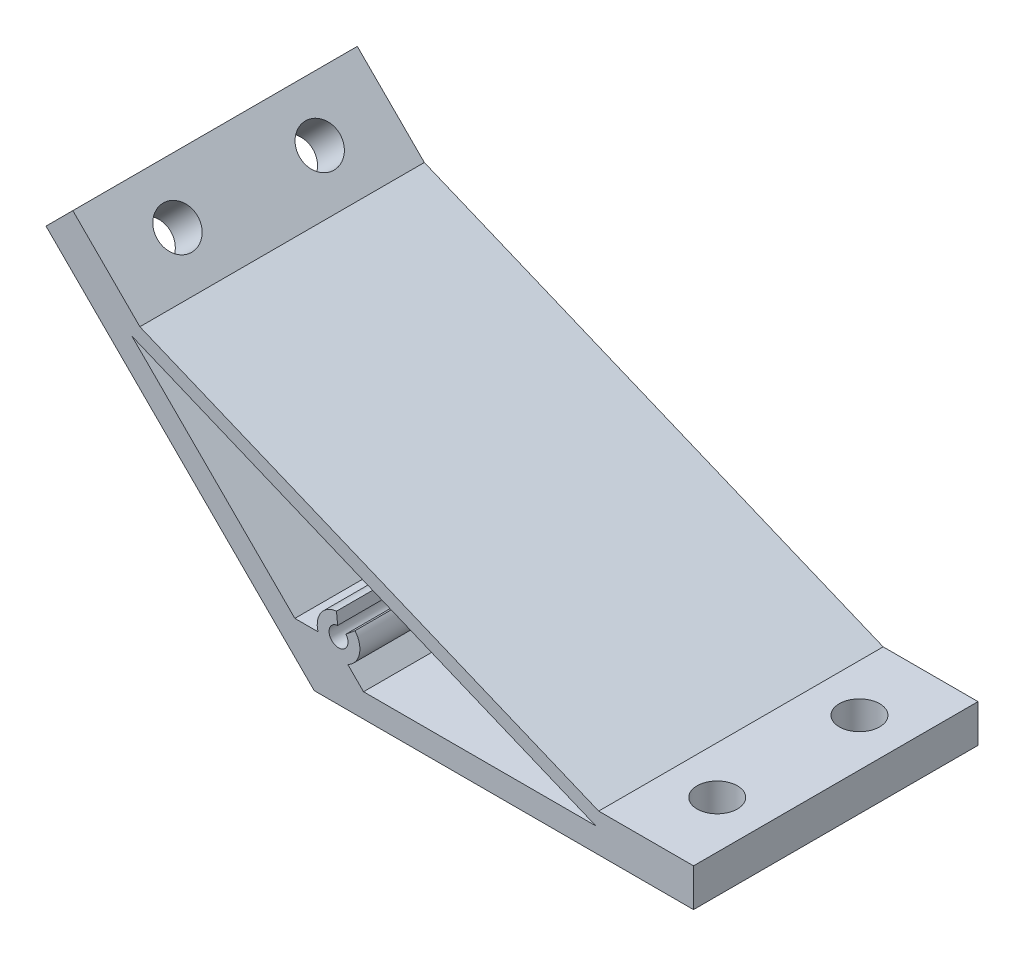
ISO-10303-21;
HEADER;
FILE_DESCRIPTION(('STEP AP214'),'2;1');
FILE_NAME('part.step','',(''),(''),'','','');
FILE_SCHEMA(('AUTOMOTIVE_DESIGN { 1 0 10303 214 1 1 1 1 }'));
ENDSEC;
DATA;
#1=APPLICATION_CONTEXT('core data for automotive mechanical design processes');
#2=APPLICATION_PROTOCOL_DEFINITION('international standard','automotive_design',2000,#1);
#3=PRODUCT_CONTEXT('',#1,'mechanical');
#4=PRODUCT('Part','Part','',(#3));
#5=PRODUCT_RELATED_PRODUCT_CATEGORY('part','',(#4));
#6=PRODUCT_DEFINITION_FORMATION('','',#4);
#7=PRODUCT_DEFINITION_CONTEXT('part definition',#1,'design');
#8=PRODUCT_DEFINITION('design','',#6,#7);
#9=PRODUCT_DEFINITION_SHAPE('','',#8);
#10=(LENGTH_UNIT() NAMED_UNIT(*) SI_UNIT(.MILLI.,.METRE.));
#11=(NAMED_UNIT(*) PLANE_ANGLE_UNIT() SI_UNIT($,.RADIAN.));
#12=(NAMED_UNIT(*) SI_UNIT($,.STERADIAN.) SOLID_ANGLE_UNIT());
#13=UNCERTAINTY_MEASURE_WITH_UNIT(LENGTH_MEASURE(1.E-05),#10,'distance_accuracy_value','');
#14=(GEOMETRIC_REPRESENTATION_CONTEXT(3) GLOBAL_UNCERTAINTY_ASSIGNED_CONTEXT((#13)) GLOBAL_UNIT_ASSIGNED_CONTEXT((#10,
#11,#12)) REPRESENTATION_CONTEXT('',''));
#15=CARTESIAN_POINT('',(0.,0.,0.));
#16=DIRECTION('',(0.,0.,1.));
#17=DIRECTION('',(1.,0.,0.));
#18=AXIS2_PLACEMENT_3D('',#15,#16,#17);
#19=CARTESIAN_POINT('',(7049.27262922413,-1279.24037910918,30.));
#20=DIRECTION('',(0.382683432365095,0.923879532511285,0.));
#21=DIRECTION('',(-0.923879532511285,0.382683432365095,0.));
#22=AXIS2_PLACEMENT_3D('',#19,#20,#21);
#23=PLANE('',#22);
#24=DIRECTION('',(0.923879532511285,-0.382683432365095,0.));
#25=VECTOR('',#24,1.);
#26=CARTESIAN_POINT('',(7049.27262922413,-1279.24037910918,-30.));
#27=LINE('',#26,#25);
#28=CARTESIAN_POINT('',(6955.91811216156,-1240.57167203307,-30.));
#29=VERTEX_POINT('',#28);
#30=CARTESIAN_POINT('',(7052.68766478326,-1280.65493315376,-30.));
#31=VERTEX_POINT('',#30);
#32=EDGE_CURVE('E286',#29,#31,#27,.T.);
#33=ORIENTED_EDGE('',*,*,#32,.F.);
#34=DIRECTION('',(0.,0.,-1.));
#35=VECTOR('',#34,1.);
#36=CARTESIAN_POINT('',(6955.91811216156,-1240.57167203307,30.));
#37=LINE('',#36,#35);
#38=CARTESIAN_POINT('',(6955.91811216156,-1240.57167203307,30.));
#39=VERTEX_POINT('',#38);
#40=EDGE_CURVE('E11',#39,#29,#37,.T.);
#41=ORIENTED_EDGE('',*,*,#40,.F.);
#42=DIRECTION('',(0.923879532511285,-0.382683432365095,0.));
#43=VECTOR('',#42,1.);
#44=CARTESIAN_POINT('',(7049.27262922413,-1279.24037910918,30.));
#45=LINE('',#44,#43);
#46=CARTESIAN_POINT('',(7052.68766478326,-1280.65493315376,30.));
#47=VERTEX_POINT('',#46);
#48=EDGE_CURVE('E254',#39,#47,#45,.T.);
#49=ORIENTED_EDGE('',*,*,#48,.T.);
#50=DIRECTION('',(0.,0.,-1.));
#51=VECTOR('',#50,1.);
#52=CARTESIAN_POINT('',(7052.68766478326,-1280.65493315376,30.));
#53=LINE('',#52,#51);
#54=EDGE_CURVE('E50',#47,#31,#53,.T.);
#55=ORIENTED_EDGE('',*,*,#54,.T.);
#56=EDGE_LOOP('',(#33,#41,#49,#55));
#57=FACE_BOUND('',#56,.T.);
#58=ADVANCED_FACE('F31',(#57),#23,.T.);
#59=CARTESIAN_POINT('',(7056.8507836413,-1341.50434351282,30.));
#60=DIRECTION('',(-0.707106781186559,-0.707106781186536,0.));
#61=DIRECTION('',(0.707106781186536,-0.707106781186559,0.));
#62=AXIS2_PLACEMENT_3D('',#59,#60,#61);
#63=PLANE('',#62);
#64=CARTESIAN_POINT('',(6948.84704434969,-1233.50060422121,-15.));
#65=DIRECTION('',(-0.707106781186559,-0.707106781186536,0.));
#66=DIRECTION('',(0.707106781186536,-0.707106781186559,0.));
#67=AXIS2_PLACEMENT_3D('',#64,#65,#66);
#68=CIRCLE('',#67,4.24999999999998);
#69=CARTESIAN_POINT('',(6951.85224816974,-1236.50580804125,-15.));
#70=VERTEX_POINT('',#69);
#71=EDGE_CURVE('E221',#70,#70,#68,.T.);
#72=ORIENTED_EDGE('',*,*,#71,.T.);
#73=EDGE_LOOP('',(#72));
#74=FACE_BOUND('',#73,.T.);
#75=CARTESIAN_POINT('',(6948.84704434969,-1233.50060422121,15.));
#76=DIRECTION('',(-0.707106781186559,-0.707106781186536,0.));
#77=DIRECTION('',(0.707106781186536,-0.707106781186559,0.));
#78=AXIS2_PLACEMENT_3D('',#75,#76,#77);
#79=CIRCLE('',#78,4.24999999999998);
#80=CARTESIAN_POINT('',(6951.85224816974,-1236.50580804125,15.));
#81=VERTEX_POINT('',#80);
#82=EDGE_CURVE('E211',#81,#81,#79,.T.);
#83=ORIENTED_EDGE('',*,*,#82,.T.);
#84=EDGE_LOOP('',(#83));
#85=FACE_BOUND('',#84,.T.);
#86=DIRECTION('',(-0.707106781186536,0.707106781186559,0.));
#87=VECTOR('',#86,1.);
#88=CARTESIAN_POINT('',(7056.8507836413,-1341.50434351282,-30.));
#89=LINE('',#88,#87);
#90=CARTESIAN_POINT('',(6941.77597653783,-1226.42953640934,-30.));
#91=VERTEX_POINT('',#90);
#92=EDGE_CURVE('E288',#29,#91,#89,.T.);
#93=ORIENTED_EDGE('',*,*,#92,.T.);
#94=DIRECTION('',(0.,0.,-1.));
#95=VECTOR('',#94,1.);
#96=CARTESIAN_POINT('',(6941.77597653783,-1226.42953640934,30.));
#97=LINE('',#96,#95);
#98=CARTESIAN_POINT('',(6941.77597653783,-1226.42953640934,30.));
#99=VERTEX_POINT('',#98);
#100=EDGE_CURVE('E41',#99,#91,#97,.T.);
#101=ORIENTED_EDGE('',*,*,#100,.F.);
#102=DIRECTION('',(-0.707106781186536,0.707106781186559,0.));
#103=VECTOR('',#102,1.);
#104=CARTESIAN_POINT('',(7056.8507836413,-1341.50434351282,30.));
#105=LINE('',#104,#103);
#106=EDGE_CURVE('E256',#39,#99,#105,.T.);
#107=ORIENTED_EDGE('',*,*,#106,.F.);
#108=ORIENTED_EDGE('',*,*,#40,.T.);
#109=EDGE_LOOP('',(#93,#101,#107,#108));
#110=FACE_BOUND('',#109,.T.);
#111=ADVANCED_FACE('F323',(#74,#85,#110),#63,.F.);
#112=CARTESIAN_POINT('',(6884.81198629003,-1283.39352665715,30.));
#113=DIRECTION('',(-0.707106781186561,0.707106781186534,0.));
#114=DIRECTION('',(-0.707106781186534,-0.707106781186561,0.));
#115=AXIS2_PLACEMENT_3D('',#112,#113,#114);
#116=PLANE('',#115);
#117=DIRECTION('',(0.707106781186534,0.707106781186561,0.));
#118=VECTOR('',#117,1.);
#119=CARTESIAN_POINT('',(6884.81198629003,-1283.39352665715,-30.));
#120=LINE('',#119,#118);
#121=CARTESIAN_POINT('',(6936.11912228833,-1232.08639065884,-30.));
#122=VERTEX_POINT('',#121);
#123=EDGE_CURVE('E291',#122,#91,#120,.T.);
#124=ORIENTED_EDGE('',*,*,#123,.F.);
#125=DIRECTION('',(0.,0.,-1.));
#126=VECTOR('',#125,1.);
#127=CARTESIAN_POINT('',(6936.11912228833,-1232.08639065884,30.));
#128=LINE('',#127,#126);
#129=CARTESIAN_POINT('',(6936.11912228833,-1232.08639065884,30.));
#130=VERTEX_POINT('',#129);
#131=EDGE_CURVE('E183',#130,#122,#128,.T.);
#132=ORIENTED_EDGE('',*,*,#131,.F.);
#133=DIRECTION('',(0.707106781186534,0.707106781186561,0.));
#134=VECTOR('',#133,1.);
#135=CARTESIAN_POINT('',(6884.81198629003,-1283.39352665715,30.));
#136=LINE('',#135,#134);
#137=EDGE_CURVE('E258',#130,#99,#136,.T.);
#138=ORIENTED_EDGE('',*,*,#137,.T.);
#139=ORIENTED_EDGE('',*,*,#100,.T.);
#140=EDGE_LOOP('',(#124,#132,#138,#139));
#141=FACE_BOUND('',#140,.T.);
#142=ADVANCED_FACE('F328',(#141),#116,.T.);
#143=CARTESIAN_POINT('',(7051.19392939181,-1347.16119776231,30.));
#144=DIRECTION('',(-0.707106781186532,-0.707106781186563,0.));
#145=DIRECTION('',(0.707106781186563,-0.707106781186532,0.));
#146=AXIS2_PLACEMENT_3D('',#143,#144,#145);
#147=PLANE('',#146);
#148=CARTESIAN_POINT('',(6943.1901901002,-1239.1574584707,-15.));
#149=DIRECTION('',(-0.707106781186532,-0.707106781186563,0.));
#150=DIRECTION('',(0.707106781186563,-0.707106781186532,0.));
#151=AXIS2_PLACEMENT_3D('',#148,#149,#150);
#152=CIRCLE('',#151,4.24999999999999);
#153=CARTESIAN_POINT('',(6946.19539392024,-1242.16266229074,-15.));
#154=VERTEX_POINT('',#153);
#155=EDGE_CURVE('E226',#154,#154,#152,.T.);
#156=ORIENTED_EDGE('',*,*,#155,.F.);
#157=EDGE_LOOP('',(#156));
#158=FACE_BOUND('',#157,.T.);
#159=CARTESIAN_POINT('',(6943.1901901002,-1239.1574584707,15.));
#160=DIRECTION('',(-0.707106781186532,-0.707106781186563,0.));
#161=DIRECTION('',(0.707106781186563,-0.707106781186532,0.));
#162=AXIS2_PLACEMENT_3D('',#159,#160,#161);
#163=CIRCLE('',#162,4.24999999999999);
#164=CARTESIAN_POINT('',(6946.19539392024,-1242.16266229074,15.));
#165=VERTEX_POINT('',#164);
#166=EDGE_CURVE('E214',#165,#165,#163,.T.);
#167=ORIENTED_EDGE('',*,*,#166,.F.);
#168=EDGE_LOOP('',(#167));
#169=FACE_BOUND('',#168,.T.);
#170=DIRECTION('',(-0.707106781186563,0.707106781186532,0.));
#171=VECTOR('',#170,1.);
#172=CARTESIAN_POINT('',(7051.19392939181,-1347.16119776231,-30.));
#173=LINE('',#172,#171);
#174=CARTESIAN_POINT('',(6992.68766478326,-1288.65493315376,-30.));
#175=VERTEX_POINT('',#174);
#176=EDGE_CURVE('E294',#175,#122,#173,.T.);
#177=ORIENTED_EDGE('',*,*,#176,.F.);
#178=DIRECTION('',(0.,0.,-1.));
#179=VECTOR('',#178,1.);
#180=CARTESIAN_POINT('',(6992.68766478326,-1288.65493315376,30.));
#181=LINE('',#180,#179);
#182=CARTESIAN_POINT('',(6992.68766478326,-1288.65493315376,30.));
#183=VERTEX_POINT('',#182);
#184=EDGE_CURVE('E181',#183,#175,#181,.T.);
#185=ORIENTED_EDGE('',*,*,#184,.F.);
#186=DIRECTION('',(-0.707106781186563,0.707106781186532,0.));
#187=VECTOR('',#186,1.);
#188=CARTESIAN_POINT('',(7051.19392939181,-1347.16119776231,30.));
#189=LINE('',#188,#187);
#190=EDGE_CURVE('E175',#183,#130,#189,.T.);
#191=ORIENTED_EDGE('',*,*,#190,.T.);
#192=ORIENTED_EDGE('',*,*,#131,.T.);
#193=EDGE_LOOP('',(#177,#185,#191,#192));
#194=FACE_BOUND('',#193,.T.);
#195=ADVANCED_FACE('F427',(#158,#169,#194),#147,.T.);
#196=CARTESIAN_POINT('',(6999.8867933935,-1288.65493315376,30.));
#197=DIRECTION('',(0.,1.,0.));
#198=DIRECTION('',(0.,0.,1.));
#199=AXIS2_PLACEMENT_3D('',#196,#197,#198);
#200=PLANE('',#199);
#201=CARTESIAN_POINT('',(7062.68766478326,-1288.65493315376,15.));
#202=DIRECTION('',(0.,-1.,0.));
#203=DIRECTION('',(0.,0.,-1.));
#204=AXIS2_PLACEMENT_3D('',#201,#202,#203);
#205=CIRCLE('',#204,4.24999999999986);
#206=CARTESIAN_POINT('',(7062.68766478326,-1288.65493315376,10.7500000000001));
#207=VERTEX_POINT('',#206);
#208=EDGE_CURVE('E414',#207,#207,#205,.T.);
#209=ORIENTED_EDGE('',*,*,#208,.F.);
#210=EDGE_LOOP('',(#209));
#211=FACE_BOUND('',#210,.T.);
#212=CARTESIAN_POINT('',(7062.68766478326,-1288.65493315376,-15.));
#213=DIRECTION('',(0.,-1.,0.));
#214=DIRECTION('',(0.,0.,-1.));
#215=AXIS2_PLACEMENT_3D('',#212,#213,#214);
#216=CIRCLE('',#215,4.24999999999986);
#217=CARTESIAN_POINT('',(7062.68766478326,-1288.65493315376,-19.2499999999999));
#218=VERTEX_POINT('',#217);
#219=EDGE_CURVE('E417',#218,#218,#216,.T.);
#220=ORIENTED_EDGE('',*,*,#219,.F.);
#221=EDGE_LOOP('',(#220));
#222=FACE_BOUND('',#221,.T.);
#223=DIRECTION('',(1.,0.,0.));
#224=VECTOR('',#223,1.);
#225=CARTESIAN_POINT('',(6999.8867933935,-1288.65493315376,-30.));
#226=LINE('',#225,#224);
#227=CARTESIAN_POINT('',(7072.68766478326,-1288.65493315376,-30.));
#228=VERTEX_POINT('',#227);
#229=EDGE_CURVE('E180',#175,#228,#226,.T.);
#230=ORIENTED_EDGE('',*,*,#229,.T.);
#231=DIRECTION('',(0.,0.,-1.));
#232=VECTOR('',#231,1.);
#233=CARTESIAN_POINT('',(7072.68766478326,-1288.65493315376,30.));
#234=LINE('',#233,#232);
#235=CARTESIAN_POINT('',(7072.68766478326,-1288.65493315376,30.));
#236=VERTEX_POINT('',#235);
#237=EDGE_CURVE('E162',#236,#228,#234,.T.);
#238=ORIENTED_EDGE('',*,*,#237,.F.);
#239=DIRECTION('',(1.,0.,0.));
#240=VECTOR('',#239,1.);
#241=CARTESIAN_POINT('',(6999.8867933935,-1288.65493315376,30.));
#242=LINE('',#241,#240);
#243=EDGE_CURVE('E167',#183,#236,#242,.T.);
#244=ORIENTED_EDGE('',*,*,#243,.F.);
#245=ORIENTED_EDGE('',*,*,#184,.T.);
#246=EDGE_LOOP('',(#230,#238,#244,#245));
#247=FACE_BOUND('',#246,.T.);
#248=ADVANCED_FACE('F178',(#211,#222,#247),#200,.F.);
#249=CARTESIAN_POINT('',(7072.68766478326,-1398.46833376062,30.));
#250=DIRECTION('',(-1.,0.,0.));
#251=DIRECTION('',(0.,0.,1.));
#252=AXIS2_PLACEMENT_3D('',#249,#250,#251);
#253=PLANE('',#252);
#254=DIRECTION('',(0.,1.,0.));
#255=VECTOR('',#254,1.);
#256=CARTESIAN_POINT('',(7072.68766478326,-1398.46833376062,-30.));
#257=LINE('',#256,#255);
#258=CARTESIAN_POINT('',(7072.68766478326,-1280.65493315376,-30.));
#259=VERTEX_POINT('',#258);
#260=EDGE_CURVE('E298',#228,#259,#257,.T.);
#261=ORIENTED_EDGE('',*,*,#260,.T.);
#262=DIRECTION('',(0.,0.,-1.));
#263=VECTOR('',#262,1.);
#264=CARTESIAN_POINT('',(7072.68766478326,-1280.65493315376,30.));
#265=LINE('',#264,#263);
#266=CARTESIAN_POINT('',(7072.68766478326,-1280.65493315376,30.));
#267=VERTEX_POINT('',#266);
#268=EDGE_CURVE('E103',#267,#259,#265,.T.);
#269=ORIENTED_EDGE('',*,*,#268,.F.);
#270=DIRECTION('',(0.,1.,0.));
#271=VECTOR('',#270,1.);
#272=CARTESIAN_POINT('',(7072.68766478326,-1398.46833376062,30.));
#273=LINE('',#272,#271);
#274=EDGE_CURVE('E158',#236,#267,#273,.T.);
#275=ORIENTED_EDGE('',*,*,#274,.F.);
#276=ORIENTED_EDGE('',*,*,#237,.T.);
#277=EDGE_LOOP('',(#261,#269,#275,#276));
#278=FACE_BOUND('',#277,.T.);
#279=ADVANCED_FACE('F160',(#278),#253,.F.);
#280=CARTESIAN_POINT('',(6997.82073881189,-1276.26412007604,30.));
#281=DIRECTION('',(0.,0.,-1.));
#282=DIRECTION('',(-1.,0.,0.));
#283=AXIS2_PLACEMENT_3D('',#280,#281,#282);
#284=CYLINDRICAL_SURFACE('',#283,1.99999999999993);
#285=CARTESIAN_POINT('',(6997.82073881189,-1276.26412007604,-30.));
#286=DIRECTION('',(0.,0.,1.));
#287=DIRECTION('',(1.,0.,0.));
#288=AXIS2_PLACEMENT_3D('',#285,#286,#287);
#289=CIRCLE('',#288,1.99999999999993);
#290=CARTESIAN_POINT('',(6997.62653003943,-1274.27357167103,-30.));
#291=VERTEX_POINT('',#290);
#292=CARTESIAN_POINT('',(6999.36559542733,-1274.99391614055,-30.));
#293=VERTEX_POINT('',#292);
#294=EDGE_CURVE('E213',#291,#293,#289,.T.);
#295=ORIENTED_EDGE('',*,*,#294,.F.);
#296=DIRECTION('',(0.,0.,-1.));
#297=VECTOR('',#296,1.);
#298=CARTESIAN_POINT('',(6997.62653003943,-1274.27357167103,30.));
#299=LINE('',#298,#297);
#300=CARTESIAN_POINT('',(6997.62653003943,-1274.27357167103,30.));
#301=VERTEX_POINT('',#300);
#302=EDGE_CURVE('E115',#301,#291,#299,.T.);
#303=ORIENTED_EDGE('',*,*,#302,.F.);
#304=CARTESIAN_POINT('',(6997.82073881189,-1276.26412007604,30.));
#305=DIRECTION('',(0.,0.,1.));
#306=DIRECTION('',(1.,0.,0.));
#307=AXIS2_PLACEMENT_3D('',#304,#305,#306);
#308=CIRCLE('',#307,1.99999999999993);
#309=CARTESIAN_POINT('',(6999.36559542733,-1274.99391614055,30.));
#310=VERTEX_POINT('',#309);
#311=EDGE_CURVE('E230',#301,#310,#308,.T.);
#312=ORIENTED_EDGE('',*,*,#311,.T.);
#313=DIRECTION('',(0.,0.,-1.));
#314=VECTOR('',#313,1.);
#315=CARTESIAN_POINT('',(6999.36559542733,-1274.99391614055,30.));
#316=LINE('',#315,#314);
#317=EDGE_CURVE('E190',#310,#293,#316,.T.);
#318=ORIENTED_EDGE('',*,*,#317,.T.);
#319=EDGE_LOOP('',(#295,#303,#312,#318));
#320=FACE_BOUND('',#319,.T.);
#321=ADVANCED_FACE('F33',(#320),#284,.F.);
#322=CARTESIAN_POINT('',(7009.65070636223,-1397.51571309221,30.));
#323=DIRECTION('',(-0.9952742025064,-0.0971043862307417,0.));
#324=DIRECTION('',(0.0971043862307417,-0.9952742025064,0.));
#325=AXIS2_PLACEMENT_3D('',#322,#323,#324);
#326=PLANE('',#325);
#327=DIRECTION('',(-0.0971043862307417,0.9952742025064,0.));
#328=VECTOR('',#327,1.);
#329=CARTESIAN_POINT('',(7009.65070636223,-1397.51571309221,-30.));
#330=LINE('',#329,#328);
#331=CARTESIAN_POINT('',(6997.38376907386,-1271.78538616476,-30.));
#332=VERTEX_POINT('',#331);
#333=EDGE_CURVE('E218',#291,#332,#330,.T.);
#334=ORIENTED_EDGE('',*,*,#333,.T.);
#335=DIRECTION('',(0.,0.,-1.));
#336=VECTOR('',#335,1.);
#337=CARTESIAN_POINT('',(6997.38376907386,-1271.78538616476,30.));
#338=LINE('',#337,#336);
#339=CARTESIAN_POINT('',(6997.38376907386,-1271.78538616476,30.));
#340=VERTEX_POINT('',#339);
#341=EDGE_CURVE('E208',#340,#332,#338,.T.);
#342=ORIENTED_EDGE('',*,*,#341,.F.);
#343=DIRECTION('',(-0.0971043862307417,0.9952742025064,0.));
#344=VECTOR('',#343,1.);
#345=CARTESIAN_POINT('',(7009.65070636223,-1397.51571309221,30.));
#346=LINE('',#345,#344);
#347=EDGE_CURVE('E232',#301,#340,#346,.T.);
#348=ORIENTED_EDGE('',*,*,#347,.F.);
#349=ORIENTED_EDGE('',*,*,#302,.T.);
#350=EDGE_LOOP('',(#334,#342,#348,#349));
#351=FACE_BOUND('',#350,.T.);
#352=ADVANCED_FACE('F358',(#351),#326,.F.);
#353=CARTESIAN_POINT('',(6997.82073881189,-1276.26412007604,30.));
#354=DIRECTION('',(0.,0.,-1.));
#355=DIRECTION('',(-1.,0.,0.));
#356=AXIS2_PLACEMENT_3D('',#353,#354,#355);
#357=CYLINDRICAL_SURFACE('',#356,4.49999999999951);
#358=CARTESIAN_POINT('',(6997.82073881189,-1276.26412007604,-30.));
#359=DIRECTION('',(0.,0.,1.));
#360=DIRECTION('',(1.,0.,0.));
#361=AXIS2_PLACEMENT_3D('',#358,#359,#360);
#362=CIRCLE('',#361,4.49999999999951);
#363=CARTESIAN_POINT('',(6993.49338103034,-1277.49861374974,-30.));
#364=VERTEX_POINT('',#363);
#365=EDGE_CURVE('E264',#332,#364,#362,.T.);
#366=ORIENTED_EDGE('',*,*,#365,.T.);
#367=DIRECTION('',(0.,0.,-1.));
#368=VECTOR('',#367,1.);
#369=CARTESIAN_POINT('',(6993.49338103034,-1277.49861374974,30.));
#370=LINE('',#369,#368);
#371=CARTESIAN_POINT('',(6993.49338103034,-1277.49861374974,30.));
#372=VERTEX_POINT('',#371);
#373=EDGE_CURVE('E206',#372,#364,#370,.T.);
#374=ORIENTED_EDGE('',*,*,#373,.F.);
#375=CARTESIAN_POINT('',(6997.82073881189,-1276.26412007604,30.));
#376=DIRECTION('',(0.,0.,1.));
#377=DIRECTION('',(1.,0.,0.));
#378=AXIS2_PLACEMENT_3D('',#375,#376,#377);
#379=CIRCLE('',#378,4.49999999999951);
#380=EDGE_CURVE('E235',#340,#372,#379,.T.);
#381=ORIENTED_EDGE('',*,*,#380,.F.);
#382=ORIENTED_EDGE('',*,*,#341,.T.);
#383=EDGE_LOOP('',(#366,#374,#381,#382));
#384=FACE_BOUND('',#383,.T.);
#385=ADVANCED_FACE('F355',(#384),#357,.T.);
#386=CARTESIAN_POINT('',(6999.88679339339,-1277.49861374973,30.));
#387=DIRECTION('',(-9.079781843749E-13,1.,0.));
#388=DIRECTION('',(-1.,-9.079781843749E-13,0.));
#389=AXIS2_PLACEMENT_3D('',#386,#387,#388);
#390=PLANE('',#389);
#391=DIRECTION('',(1.,9.079781843749E-13,0.));
#392=VECTOR('',#391,1.);
#393=CARTESIAN_POINT('',(6999.88679339339,-1277.49861374973,-30.));
#394=LINE('',#393,#392);
#395=CARTESIAN_POINT('',(6988.60241319111,-1277.49861374974,-30.));
#396=VERTEX_POINT('',#395);
#397=EDGE_CURVE('E267',#396,#364,#394,.T.);
#398=ORIENTED_EDGE('',*,*,#397,.F.);
#399=DIRECTION('',(0.,0.,-1.));
#400=VECTOR('',#399,1.);
#401=CARTESIAN_POINT('',(6988.60241319111,-1277.49861374974,30.));
#402=LINE('',#401,#400);
#403=CARTESIAN_POINT('',(6988.60241319111,-1277.49861374974,30.));
#404=VERTEX_POINT('',#403);
#405=EDGE_CURVE('E204',#404,#396,#402,.T.);
#406=ORIENTED_EDGE('',*,*,#405,.F.);
#407=DIRECTION('',(1.,9.079781843749E-13,0.));
#408=VECTOR('',#407,1.);
#409=CARTESIAN_POINT('',(6999.88679339339,-1277.49861374973,30.));
#410=LINE('',#409,#408);
#411=EDGE_CURVE('E237',#404,#372,#410,.T.);
#412=ORIENTED_EDGE('',*,*,#411,.T.);
#413=ORIENTED_EDGE('',*,*,#373,.T.);
#414=EDGE_LOOP('',(#398,#406,#412,#413));
#415=FACE_BOUND('',#414,.T.);
#416=ADVANCED_FACE('F351',(#415),#390,.T.);
#417=CARTESIAN_POINT('',(7054.72946329774,-1343.62566385638,30.));
#418=DIRECTION('',(-0.707106781186552,-0.707106781186543,0.));
#419=DIRECTION('',(0.707106781186543,-0.707106781186552,0.));
#420=AXIS2_PLACEMENT_3D('',#417,#418,#419);
#421=PLANE('',#420);
#422=DIRECTION('',(-0.707106781186543,0.707106781186552,0.));
#423=VECTOR('',#422,1.);
#424=CARTESIAN_POINT('',(7054.72946329774,-1343.62566385638,-30.));
#425=LINE('',#424,#423);
#426=CARTESIAN_POINT('',(6954.2187486695,-1243.11494922814,-30.));
#427=VERTEX_POINT('',#426);
#428=EDGE_CURVE('E270',#396,#427,#425,.T.);
#429=ORIENTED_EDGE('',*,*,#428,.T.);
#430=DIRECTION('',(0.,0.,-1.));
#431=VECTOR('',#430,1.);
#432=CARTESIAN_POINT('',(6954.2187486695,-1243.11494922814,30.));
#433=LINE('',#432,#431);
#434=CARTESIAN_POINT('',(6954.2187486695,-1243.11494922814,30.));
#435=VERTEX_POINT('',#434);
#436=EDGE_CURVE('E201',#435,#427,#433,.T.);
#437=ORIENTED_EDGE('',*,*,#436,.F.);
#438=DIRECTION('',(-0.707106781186543,0.707106781186552,0.));
#439=VECTOR('',#438,1.);
#440=CARTESIAN_POINT('',(7054.72946329774,-1343.62566385638,30.));
#441=LINE('',#440,#439);
#442=EDGE_CURVE('E240',#404,#435,#441,.T.);
#443=ORIENTED_EDGE('',*,*,#442,.F.);
#444=ORIENTED_EDGE('',*,*,#405,.T.);
#445=EDGE_LOOP('',(#429,#437,#443,#444));
#446=FACE_BOUND('',#445,.T.);
#447=ADVANCED_FACE('F347',(#446),#421,.F.);
#448=CARTESIAN_POINT('',(7048.12457892704,-1282.01201770672,30.));
#449=DIRECTION('',(0.3826834323651,0.923879532511283,0.));
#450=DIRECTION('',(-0.923879532511283,0.3826834323651,0.));
#451=AXIS2_PLACEMENT_3D('',#448,#449,#450);
#452=PLANE('',#451);
#453=DIRECTION('',(0.923879532511283,-0.3826834323651,0.));
#454=VECTOR('',#453,1.);
#455=CARTESIAN_POINT('',(7048.12457892704,-1282.01201770672,-30.));
#456=LINE('',#455,#454);
#457=CARTESIAN_POINT('',(7052.09092768112,-1283.65493315376,-30.));
#458=VERTEX_POINT('',#457);
#459=EDGE_CURVE('E272',#427,#458,#456,.T.);
#460=ORIENTED_EDGE('',*,*,#459,.T.);
#461=DIRECTION('',(0.,0.,-1.));
#462=VECTOR('',#461,1.);
#463=CARTESIAN_POINT('',(7052.09092768112,-1283.65493315376,30.));
#464=LINE('',#463,#462);
#465=CARTESIAN_POINT('',(7052.09092768112,-1283.65493315376,30.));
#466=VERTEX_POINT('',#465);
#467=EDGE_CURVE('E199',#466,#458,#464,.T.);
#468=ORIENTED_EDGE('',*,*,#467,.F.);
#469=DIRECTION('',(0.923879532511283,-0.3826834323651,0.));
#470=VECTOR('',#469,1.);
#471=CARTESIAN_POINT('',(7048.12457892704,-1282.01201770672,30.));
#472=LINE('',#471,#470);
#473=EDGE_CURVE('E242',#435,#466,#472,.T.);
#474=ORIENTED_EDGE('',*,*,#473,.F.);
#475=ORIENTED_EDGE('',*,*,#436,.T.);
#476=EDGE_LOOP('',(#460,#468,#474,#475));
#477=FACE_BOUND('',#476,.T.);
#478=ADVANCED_FACE('F343',(#477),#452,.F.);
#479=CARTESIAN_POINT('',(6999.8867933935,-1283.65493315376,30.));
#480=DIRECTION('',(0.,1.,0.));
#481=DIRECTION('',(-1.,0.,0.));
#482=AXIS2_PLACEMENT_3D('',#479,#480,#481);
#483=PLANE('',#482);
#484=DIRECTION('',(1.,0.,0.));
#485=VECTOR('',#484,1.);
#486=CARTESIAN_POINT('',(6999.8867933935,-1283.65493315376,-30.));
#487=LINE('',#486,#485);
#488=CARTESIAN_POINT('',(7003.09092768112,-1283.65493315376,-30.));
#489=VERTEX_POINT('',#488);
#490=EDGE_CURVE('E275',#489,#458,#487,.T.);
#491=ORIENTED_EDGE('',*,*,#490,.F.);
#492=DIRECTION('',(0.,0.,-1.));
#493=VECTOR('',#492,1.);
#494=CARTESIAN_POINT('',(7003.09092768112,-1283.65493315376,30.));
#495=LINE('',#494,#493);
#496=CARTESIAN_POINT('',(7003.09092768112,-1283.65493315376,30.));
#497=VERTEX_POINT('',#496);
#498=EDGE_CURVE('E197',#497,#489,#495,.T.);
#499=ORIENTED_EDGE('',*,*,#498,.F.);
#500=DIRECTION('',(1.,0.,0.));
#501=VECTOR('',#500,1.);
#502=CARTESIAN_POINT('',(6999.8867933935,-1283.65493315376,30.));
#503=LINE('',#502,#501);
#504=EDGE_CURVE('E244',#497,#466,#503,.T.);
#505=ORIENTED_EDGE('',*,*,#504,.T.);
#506=ORIENTED_EDGE('',*,*,#467,.T.);
#507=EDGE_LOOP('',(#491,#499,#505,#506));
#508=FACE_BOUND('',#507,.T.);
#509=ADVANCED_FACE('F339',(#508),#483,.T.);
#510=CARTESIAN_POINT('',(7058.89556084074,-1339.4595663134,30.));
#511=DIRECTION('',(-0.707106781186689,-0.707106781186406,0.));
#512=DIRECTION('',(0.707106781186406,-0.707106781186689,0.));
#513=AXIS2_PLACEMENT_3D('',#510,#511,#512);
#514=PLANE('',#513);
#515=DIRECTION('',(-0.707106781186406,0.707106781186689,0.));
#516=VECTOR('',#515,1.);
#517=CARTESIAN_POINT('',(7058.89556084074,-1339.4595663134,-30.));
#518=LINE('',#517,#516);
#519=CARTESIAN_POINT('',(6999.76054974539,-1280.32455521803,-30.));
#520=VERTEX_POINT('',#519);
#521=EDGE_CURVE('E278',#489,#520,#518,.T.);
#522=ORIENTED_EDGE('',*,*,#521,.T.);
#523=DIRECTION('',(0.,0.,-1.));
#524=VECTOR('',#523,1.);
#525=CARTESIAN_POINT('',(6999.76054974539,-1280.32455521803,30.));
#526=LINE('',#525,#524);
#527=CARTESIAN_POINT('',(6999.76054974539,-1280.32455521803,30.));
#528=VERTEX_POINT('',#527);
#529=EDGE_CURVE('E194',#528,#520,#526,.T.);
#530=ORIENTED_EDGE('',*,*,#529,.F.);
#531=DIRECTION('',(-0.707106781186406,0.707106781186689,0.));
#532=VECTOR('',#531,1.);
#533=CARTESIAN_POINT('',(7058.89556084074,-1339.4595663134,30.));
#534=LINE('',#533,#532);
#535=EDGE_CURVE('E247',#497,#528,#534,.T.);
#536=ORIENTED_EDGE('',*,*,#535,.F.);
#537=ORIENTED_EDGE('',*,*,#498,.T.);
#538=EDGE_LOOP('',(#522,#530,#536,#537));
#539=FACE_BOUND('',#538,.T.);
#540=ADVANCED_FACE('F335',(#539),#514,.F.);
#541=CARTESIAN_POINT('',(6997.82073881189,-1276.26412007604,30.));
#542=DIRECTION('',(0.,0.,-1.));
#543=DIRECTION('',(-1.,0.,0.));
#544=AXIS2_PLACEMENT_3D('',#541,#542,#543);
#545=CYLINDRICAL_SURFACE('',#544,4.50000000000019);
#546=CARTESIAN_POINT('',(6997.82073881189,-1276.26412007604,-30.));
#547=DIRECTION('',(0.,0.,1.));
#548=DIRECTION('',(1.,0.,0.));
#549=AXIS2_PLACEMENT_3D('',#546,#547,#548);
#550=CIRCLE('',#549,4.50000000000019);
#551=CARTESIAN_POINT('',(7001.29666619663,-1273.40616122118,-30.));
#552=VERTEX_POINT('',#551);
#553=EDGE_CURVE('E280',#520,#552,#550,.T.);
#554=ORIENTED_EDGE('',*,*,#553,.T.);
#555=DIRECTION('',(0.,0.,-1.));
#556=VECTOR('',#555,1.);
#557=CARTESIAN_POINT('',(7001.29666619663,-1273.40616122118,30.));
#558=LINE('',#557,#556);
#559=CARTESIAN_POINT('',(7001.29666619663,-1273.40616122118,30.));
#560=VERTEX_POINT('',#559);
#561=EDGE_CURVE('E192',#560,#552,#558,.T.);
#562=ORIENTED_EDGE('',*,*,#561,.F.);
#563=CARTESIAN_POINT('',(6997.82073881189,-1276.26412007604,30.));
#564=DIRECTION('',(0.,0.,1.));
#565=DIRECTION('',(1.,0.,0.));
#566=AXIS2_PLACEMENT_3D('',#563,#564,#565);
#567=CIRCLE('',#566,4.50000000000019);
#568=EDGE_CURVE('E249',#528,#560,#567,.T.);
#569=ORIENTED_EDGE('',*,*,#568,.F.);
#570=ORIENTED_EDGE('',*,*,#529,.T.);
#571=EDGE_LOOP('',(#554,#562,#569,#570));
#572=FACE_BOUND('',#571,.T.);
#573=ADVANCED_FACE('F315',(#572),#545,.T.);
#574=CARTESIAN_POINT('',(6939.10362964596,-1324.54219481639,30.));
#575=DIRECTION('',(-0.63510196774562,0.772428307719002,0.));
#576=DIRECTION('',(-0.772428307719002,-0.63510196774562,0.));
#577=AXIS2_PLACEMENT_3D('',#574,#575,#576);
#578=PLANE('',#577);
#579=DIRECTION('',(0.772428307719002,0.63510196774562,0.));
#580=VECTOR('',#579,1.);
#581=CARTESIAN_POINT('',(6939.10362964596,-1324.54219481639,-30.));
#582=LINE('',#581,#580);
#583=EDGE_CURVE('E283',#293,#552,#582,.T.);
#584=ORIENTED_EDGE('',*,*,#583,.F.);
#585=ORIENTED_EDGE('',*,*,#317,.F.);
#586=DIRECTION('',(0.772428307719002,0.63510196774562,0.));
#587=VECTOR('',#586,1.);
#588=CARTESIAN_POINT('',(6939.10362964596,-1324.54219481639,30.));
#589=LINE('',#588,#587);
#590=EDGE_CURVE('E251',#310,#560,#589,.T.);
#591=ORIENTED_EDGE('',*,*,#590,.T.);
#592=ORIENTED_EDGE('',*,*,#561,.T.);
#593=EDGE_LOOP('',(#584,#585,#591,#592));
#594=FACE_BOUND('',#593,.T.);
#595=ADVANCED_FACE('F306',(#594),#578,.T.);
#596=CARTESIAN_POINT('',(6999.8867933935,-1280.65493315376,30.));
#597=DIRECTION('',(0.,1.,0.));
#598=DIRECTION('',(0.,0.,1.));
#599=AXIS2_PLACEMENT_3D('',#596,#597,#598);
#600=PLANE('',#599);
#601=CARTESIAN_POINT('',(7062.68766478326,-1280.65493315376,15.));
#602=DIRECTION('',(0.,1.,0.));
#603=DIRECTION('',(0.,0.,1.));
#604=AXIS2_PLACEMENT_3D('',#601,#602,#603);
#605=CIRCLE('',#604,4.24999999999986);
#606=CARTESIAN_POINT('',(7062.68766478326,-1280.65493315376,19.2499999999999));
#607=VERTEX_POINT('',#606);
#608=EDGE_CURVE('E35',#607,#607,#605,.T.);
#609=ORIENTED_EDGE('',*,*,#608,.F.);
#610=EDGE_LOOP('',(#609));
#611=FACE_BOUND('',#610,.T.);
#612=CARTESIAN_POINT('',(7062.68766478326,-1280.65493315376,-15.));
#613=DIRECTION('',(0.,1.,0.));
#614=DIRECTION('',(0.,0.,1.));
#615=AXIS2_PLACEMENT_3D('',#612,#613,#614);
#616=CIRCLE('',#615,4.24999999999986);
#617=CARTESIAN_POINT('',(7062.68766478326,-1280.65493315376,-10.7500000000001));
#618=VERTEX_POINT('',#617);
#619=EDGE_CURVE('E421',#618,#618,#616,.T.);
#620=ORIENTED_EDGE('',*,*,#619,.F.);
#621=EDGE_LOOP('',(#620));
#622=FACE_BOUND('',#621,.T.);
#623=DIRECTION('',(1.,0.,0.));
#624=VECTOR('',#623,1.);
#625=CARTESIAN_POINT('',(6999.8867933935,-1280.65493315376,-30.));
#626=LINE('',#625,#624);
#627=EDGE_CURVE('E233',#31,#259,#626,.T.);
#628=ORIENTED_EDGE('',*,*,#627,.F.);
#629=ORIENTED_EDGE('',*,*,#54,.F.);
#630=DIRECTION('',(1.,0.,0.));
#631=VECTOR('',#630,1.);
#632=CARTESIAN_POINT('',(6999.8867933935,-1280.65493315376,30.));
#633=LINE('',#632,#631);
#634=EDGE_CURVE('E166',#47,#267,#633,.T.);
#635=ORIENTED_EDGE('',*,*,#634,.T.);
#636=ORIENTED_EDGE('',*,*,#268,.T.);
#637=EDGE_LOOP('',(#628,#629,#635,#636));
#638=FACE_BOUND('',#637,.T.);
#639=ADVANCED_FACE('F304',(#611,#622,#638),#600,.T.);
#640=CARTESIAN_POINT('',(6999.8867933935,-1398.46833376062,30.));
#641=DIRECTION('',(0.,0.,1.));
#642=DIRECTION('',(1.,0.,0.));
#643=AXIS2_PLACEMENT_3D('',#640,#641,#642);
#644=PLANE('',#643);
#645=ORIENTED_EDGE('',*,*,#311,.F.);
#646=ORIENTED_EDGE('',*,*,#347,.T.);
#647=ORIENTED_EDGE('',*,*,#380,.T.);
#648=ORIENTED_EDGE('',*,*,#411,.F.);
#649=ORIENTED_EDGE('',*,*,#442,.T.);
#650=ORIENTED_EDGE('',*,*,#473,.T.);
#651=ORIENTED_EDGE('',*,*,#504,.F.);
#652=ORIENTED_EDGE('',*,*,#535,.T.);
#653=ORIENTED_EDGE('',*,*,#568,.T.);
#654=ORIENTED_EDGE('',*,*,#590,.F.);
#655=EDGE_LOOP('',(#645,#646,#647,#648,#649,#650,#651,#652,#653,#654));
#656=FACE_BOUND('',#655,.T.);
#657=ORIENTED_EDGE('',*,*,#48,.F.);
#658=ORIENTED_EDGE('',*,*,#106,.T.);
#659=ORIENTED_EDGE('',*,*,#137,.F.);
#660=ORIENTED_EDGE('',*,*,#190,.F.);
#661=ORIENTED_EDGE('',*,*,#243,.T.);
#662=ORIENTED_EDGE('',*,*,#274,.T.);
#663=ORIENTED_EDGE('',*,*,#634,.F.);
#664=EDGE_LOOP('',(#657,#658,#659,#660,#661,#662,#663));
#665=FACE_BOUND('',#664,.T.);
#666=ADVANCED_FACE('F172',(#656,#665),#644,.T.);
#667=CARTESIAN_POINT('',(6999.8867933935,-1398.46833376062,-30.));
#668=DIRECTION('',(0.,0.,1.));
#669=DIRECTION('',(1.,0.,0.));
#670=AXIS2_PLACEMENT_3D('',#667,#668,#669);
#671=PLANE('',#670);
#672=ORIENTED_EDGE('',*,*,#294,.T.);
#673=ORIENTED_EDGE('',*,*,#583,.T.);
#674=ORIENTED_EDGE('',*,*,#553,.F.);
#675=ORIENTED_EDGE('',*,*,#521,.F.);
#676=ORIENTED_EDGE('',*,*,#490,.T.);
#677=ORIENTED_EDGE('',*,*,#459,.F.);
#678=ORIENTED_EDGE('',*,*,#428,.F.);
#679=ORIENTED_EDGE('',*,*,#397,.T.);
#680=ORIENTED_EDGE('',*,*,#365,.F.);
#681=ORIENTED_EDGE('',*,*,#333,.F.);
#682=EDGE_LOOP('',(#672,#673,#674,#675,#676,#677,#678,#679,#680,#681));
#683=FACE_BOUND('',#682,.T.);
#684=ORIENTED_EDGE('',*,*,#32,.T.);
#685=ORIENTED_EDGE('',*,*,#627,.T.);
#686=ORIENTED_EDGE('',*,*,#260,.F.);
#687=ORIENTED_EDGE('',*,*,#229,.F.);
#688=ORIENTED_EDGE('',*,*,#176,.T.);
#689=ORIENTED_EDGE('',*,*,#123,.T.);
#690=ORIENTED_EDGE('',*,*,#92,.F.);
#691=EDGE_LOOP('',(#684,#685,#686,#687,#688,#689,#690));
#692=FACE_BOUND('',#691,.T.);
#693=ADVANCED_FACE('F302',(#683,#692),#671,.F.);
#694=CARTESIAN_POINT('',(6943.1901901002,-1239.1574584707,15.));
#695=DIRECTION('',(-0.707106781186532,-0.707106781186563,0.));
#696=DIRECTION('',(0.707106781186563,-0.707106781186532,0.));
#697=AXIS2_PLACEMENT_3D('',#694,#695,#696);
#698=CYLINDRICAL_SURFACE('',#697,4.24999999999998);
#699=ORIENTED_EDGE('',*,*,#166,.T.);
#700=EDGE_LOOP('',(#699));
#701=FACE_BOUND('',#700,.T.);
#702=ORIENTED_EDGE('',*,*,#82,.F.);
#703=EDGE_LOOP('',(#702));
#704=FACE_BOUND('',#703,.T.);
#705=ADVANCED_FACE('F391',(#701,#704),#698,.F.);
#706=CARTESIAN_POINT('',(6943.1901901002,-1239.1574584707,-15.));
#707=DIRECTION('',(-0.707106781186532,-0.707106781186563,0.));
#708=DIRECTION('',(0.707106781186563,-0.707106781186532,0.));
#709=AXIS2_PLACEMENT_3D('',#706,#707,#708);
#710=CYLINDRICAL_SURFACE('',#709,4.24999999999998);
#711=ORIENTED_EDGE('',*,*,#155,.T.);
#712=EDGE_LOOP('',(#711));
#713=FACE_BOUND('',#712,.T.);
#714=ORIENTED_EDGE('',*,*,#71,.F.);
#715=EDGE_LOOP('',(#714));
#716=FACE_BOUND('',#715,.T.);
#717=ADVANCED_FACE('F395',(#713,#716),#710,.F.);
#718=CARTESIAN_POINT('',(7062.68766478326,-1288.65493315376,-15.));
#719=DIRECTION('',(0.,-1.,0.));
#720=DIRECTION('',(0.,0.,-1.));
#721=AXIS2_PLACEMENT_3D('',#718,#719,#720);
#722=CYLINDRICAL_SURFACE('',#721,4.24999999999986);
#723=ORIENTED_EDGE('',*,*,#619,.T.);
#724=EDGE_LOOP('',(#723));
#725=FACE_BOUND('',#724,.T.);
#726=ORIENTED_EDGE('',*,*,#219,.T.);
#727=EDGE_LOOP('',(#726));
#728=FACE_BOUND('',#727,.T.);
#729=ADVANCED_FACE('F400',(#725,#728),#722,.F.);
#730=CARTESIAN_POINT('',(7062.68766478326,-1288.65493315376,15.));
#731=DIRECTION('',(0.,-1.,0.));
#732=DIRECTION('',(0.,0.,-1.));
#733=AXIS2_PLACEMENT_3D('',#730,#731,#732);
#734=CYLINDRICAL_SURFACE('',#733,4.24999999999986);
#735=ORIENTED_EDGE('',*,*,#608,.T.);
#736=EDGE_LOOP('',(#735));
#737=FACE_BOUND('',#736,.T.);
#738=ORIENTED_EDGE('',*,*,#208,.T.);
#739=EDGE_LOOP('',(#738));
#740=FACE_BOUND('',#739,.T.);
#741=ADVANCED_FACE('F404',(#737,#740),#734,.F.);
#742=CLOSED_SHELL('',(#58,#111,#142,#195,#248,#279,#321,#352,#385,#416,#447,#478,#509,#540,#573,
#595,#639,#666,#693,#705,#717,#729,#741));
#743=MANIFOLD_SOLID_BREP('B2',#742);
#744=ADVANCED_BREP_SHAPE_REPRESENTATION('',(#18,#743),#14);
#745=SHAPE_DEFINITION_REPRESENTATION(#9,#744);
ENDSEC;
END-ISO-10303-21;
